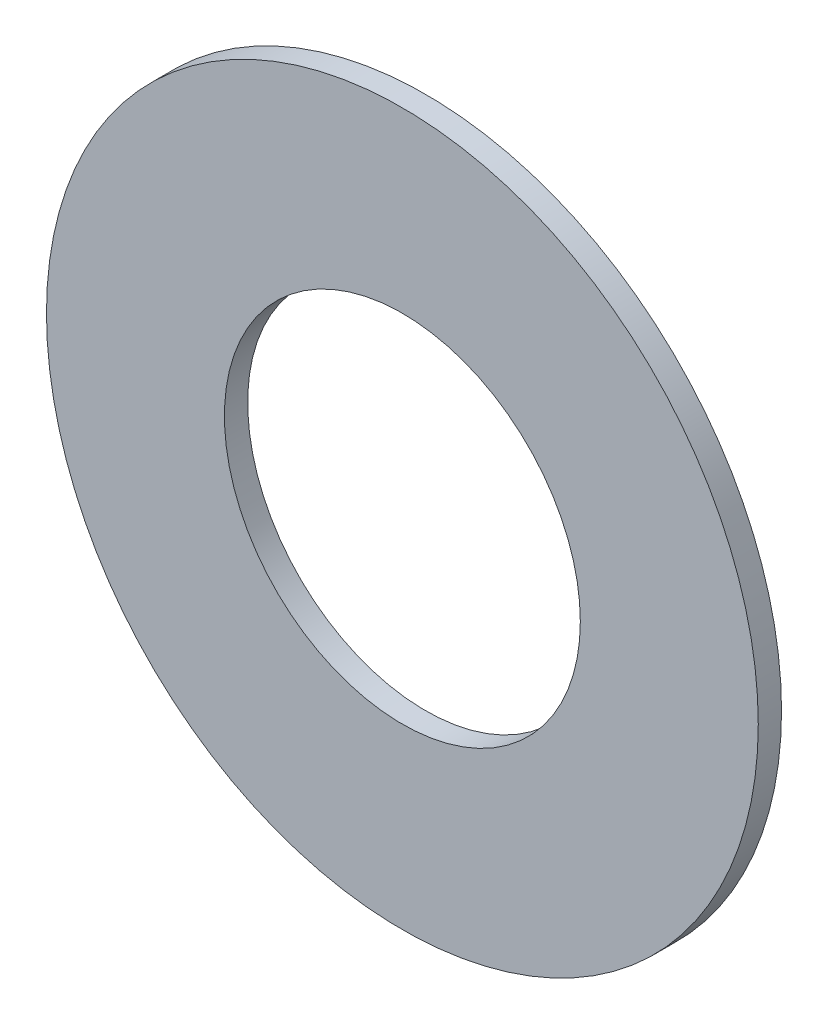
ISO-10303-21;
HEADER;
FILE_DESCRIPTION(('STEP AP214'),'2;1');
FILE_NAME('part.step','',(''),(''),'','','');
FILE_SCHEMA(('AUTOMOTIVE_DESIGN { 1 0 10303 214 1 1 1 1 }'));
ENDSEC;
DATA;
#1=APPLICATION_CONTEXT('core data for automotive mechanical design processes');
#2=APPLICATION_PROTOCOL_DEFINITION('international standard','automotive_design',2000,#1);
#3=PRODUCT_CONTEXT('',#1,'mechanical');
#4=PRODUCT('Part','Part','',(#3));
#5=PRODUCT_RELATED_PRODUCT_CATEGORY('part','',(#4));
#6=PRODUCT_DEFINITION_FORMATION('','',#4);
#7=PRODUCT_DEFINITION_CONTEXT('part definition',#1,'design');
#8=PRODUCT_DEFINITION('design','',#6,#7);
#9=PRODUCT_DEFINITION_SHAPE('','',#8);
#10=(LENGTH_UNIT() NAMED_UNIT(*) SI_UNIT(.MILLI.,.METRE.));
#11=(NAMED_UNIT(*) PLANE_ANGLE_UNIT() SI_UNIT($,.RADIAN.));
#12=(NAMED_UNIT(*) SI_UNIT($,.STERADIAN.) SOLID_ANGLE_UNIT());
#13=UNCERTAINTY_MEASURE_WITH_UNIT(LENGTH_MEASURE(1.E-05),#10,'distance_accuracy_value','');
#14=(GEOMETRIC_REPRESENTATION_CONTEXT(3) GLOBAL_UNCERTAINTY_ASSIGNED_CONTEXT((#13)) GLOBAL_UNIT_ASSIGNED_CONTEXT((#10,
#11,#12)) REPRESENTATION_CONTEXT('',''));
#15=CARTESIAN_POINT('',(0.,0.,0.));
#16=DIRECTION('',(0.,0.,1.));
#17=DIRECTION('',(1.,0.,0.));
#18=AXIS2_PLACEMENT_3D('',#15,#16,#17);
#19=CARTESIAN_POINT('',(0.,0.,1.2446));
#20=DIRECTION('',(0.,0.,1.));
#21=DIRECTION('',(1.,0.,0.));
#22=AXIS2_PLACEMENT_3D('',#19,#20,#21);
#23=PLANE('',#22);
#24=CARTESIAN_POINT('',(0.,0.,1.2446));
#25=DIRECTION('',(0.,0.,1.));
#26=DIRECTION('',(1.,0.,0.));
#27=AXIS2_PLACEMENT_3D('',#24,#25,#26);
#28=CIRCLE('',#27,19.05);
#29=CARTESIAN_POINT('',(19.05,0.,1.2446));
#30=VERTEX_POINT('',#29);
#31=EDGE_CURVE('E10',#30,#30,#28,.T.);
#32=ORIENTED_EDGE('',*,*,#31,.T.);
#33=EDGE_LOOP('',(#32));
#34=FACE_BOUND('',#33,.T.);
#35=CARTESIAN_POINT('',(0.,0.,1.2446));
#36=DIRECTION('',(0.,0.,1.));
#37=DIRECTION('',(1.,0.,0.));
#38=AXIS2_PLACEMENT_3D('',#35,#36,#37);
#39=CIRCLE('',#38,9.525);
#40=CARTESIAN_POINT('',(9.525,0.,1.2446));
#41=VERTEX_POINT('',#40);
#42=EDGE_CURVE('E48',#41,#41,#39,.T.);
#43=ORIENTED_EDGE('',*,*,#42,.F.);
#44=EDGE_LOOP('',(#43));
#45=FACE_BOUND('',#44,.T.);
#46=ADVANCED_FACE('F37',(#34,#45),#23,.T.);
#47=CARTESIAN_POINT('',(0.,0.,0.));
#48=DIRECTION('',(0.,0.,1.));
#49=DIRECTION('',(1.,0.,0.));
#50=AXIS2_PLACEMENT_3D('',#47,#48,#49);
#51=PLANE('',#50);
#52=CARTESIAN_POINT('',(0.,0.,0.));
#53=DIRECTION('',(0.,0.,1.));
#54=DIRECTION('',(1.,0.,0.));
#55=AXIS2_PLACEMENT_3D('',#52,#53,#54);
#56=CIRCLE('',#55,19.05);
#57=CARTESIAN_POINT('',(19.05,0.,0.));
#58=VERTEX_POINT('',#57);
#59=EDGE_CURVE('E41',#58,#58,#56,.T.);
#60=ORIENTED_EDGE('',*,*,#59,.F.);
#61=EDGE_LOOP('',(#60));
#62=FACE_BOUND('',#61,.T.);
#63=CARTESIAN_POINT('',(0.,0.,0.));
#64=DIRECTION('',(0.,0.,1.));
#65=DIRECTION('',(1.,0.,0.));
#66=AXIS2_PLACEMENT_3D('',#63,#64,#65);
#67=CIRCLE('',#66,9.525);
#68=CARTESIAN_POINT('',(9.525,0.,0.));
#69=VERTEX_POINT('',#68);
#70=EDGE_CURVE('E50',#69,#69,#67,.T.);
#71=ORIENTED_EDGE('',*,*,#70,.T.);
#72=EDGE_LOOP('',(#71));
#73=FACE_BOUND('',#72,.T.);
#74=ADVANCED_FACE('F60',(#62,#73),#51,.F.);
#75=CARTESIAN_POINT('',(0.,0.,1.2446));
#76=DIRECTION('',(0.,0.,-1.));
#77=DIRECTION('',(-1.,0.,0.));
#78=AXIS2_PLACEMENT_3D('',#75,#76,#77);
#79=CYLINDRICAL_SURFACE('',#78,19.05);
#80=ORIENTED_EDGE('',*,*,#31,.F.);
#81=EDGE_LOOP('',(#80));
#82=FACE_BOUND('',#81,.T.);
#83=ORIENTED_EDGE('',*,*,#59,.T.);
#84=EDGE_LOOP('',(#83));
#85=FACE_BOUND('',#84,.T.);
#86=ADVANCED_FACE('F39',(#82,#85),#79,.T.);
#87=CARTESIAN_POINT('',(0.,0.,1.2446));
#88=DIRECTION('',(0.,0.,-1.));
#89=DIRECTION('',(-1.,0.,0.));
#90=AXIS2_PLACEMENT_3D('',#87,#88,#89);
#91=CYLINDRICAL_SURFACE('',#90,9.525);
#92=ORIENTED_EDGE('',*,*,#42,.T.);
#93=EDGE_LOOP('',(#92));
#94=FACE_BOUND('',#93,.T.);
#95=ORIENTED_EDGE('',*,*,#70,.F.);
#96=EDGE_LOOP('',(#95));
#97=FACE_BOUND('',#96,.T.);
#98=ADVANCED_FACE('F56',(#94,#97),#91,.F.);
#99=CLOSED_SHELL('',(#46,#74,#86,#98));
#100=MANIFOLD_SOLID_BREP('B2',#99);
#101=ADVANCED_BREP_SHAPE_REPRESENTATION('',(#18,#100),#14);
#102=SHAPE_DEFINITION_REPRESENTATION(#9,#101);
ENDSEC;
END-ISO-10303-21;
